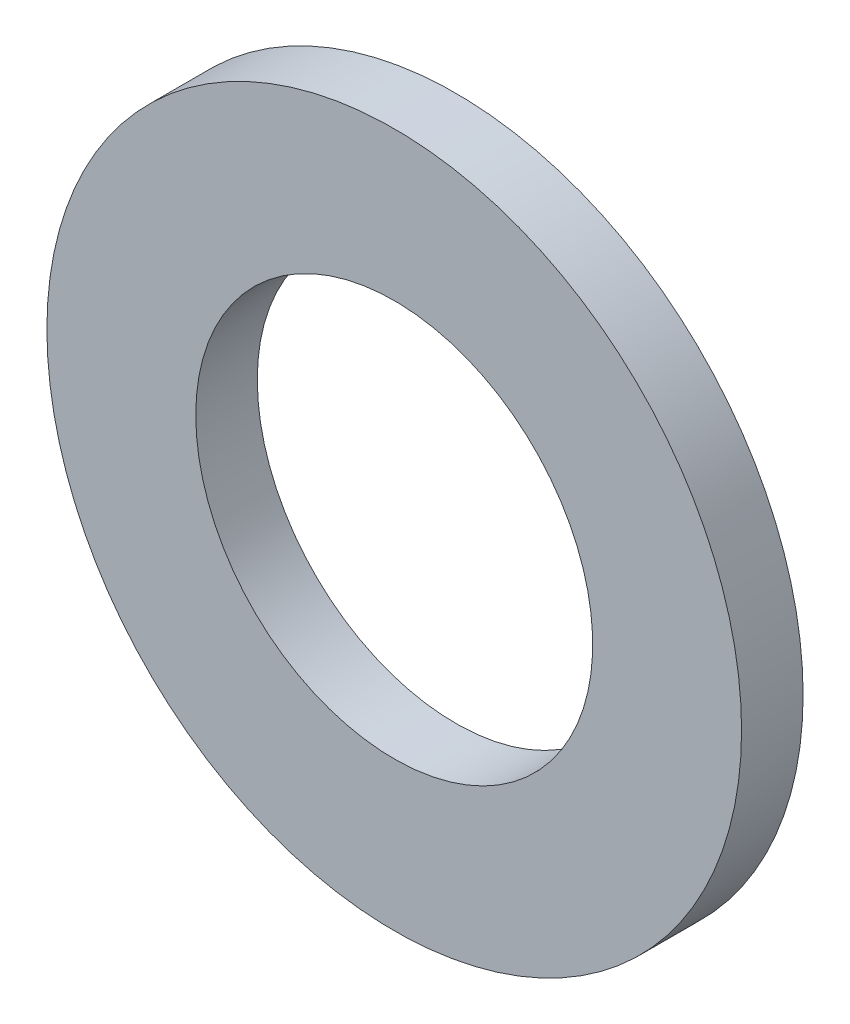
ISO-10303-21;
HEADER;
FILE_DESCRIPTION(('STEP AP214'),'2;1');
FILE_NAME('part.step','',(''),(''),'','','');
FILE_SCHEMA(('AUTOMOTIVE_DESIGN { 1 0 10303 214 1 1 1 1 }'));
ENDSEC;
DATA;
#1=APPLICATION_CONTEXT('core data for automotive mechanical design processes');
#2=APPLICATION_PROTOCOL_DEFINITION('international standard','automotive_design',2000,#1);
#3=PRODUCT_CONTEXT('',#1,'mechanical');
#4=PRODUCT('Part','Part','',(#3));
#5=PRODUCT_RELATED_PRODUCT_CATEGORY('part','',(#4));
#6=PRODUCT_DEFINITION_FORMATION('','',#4);
#7=PRODUCT_DEFINITION_CONTEXT('part definition',#1,'design');
#8=PRODUCT_DEFINITION('design','',#6,#7);
#9=PRODUCT_DEFINITION_SHAPE('','',#8);
#10=(LENGTH_UNIT() NAMED_UNIT(*) SI_UNIT(.MILLI.,.METRE.));
#11=(NAMED_UNIT(*) PLANE_ANGLE_UNIT() SI_UNIT($,.RADIAN.));
#12=(NAMED_UNIT(*) SI_UNIT($,.STERADIAN.) SOLID_ANGLE_UNIT());
#13=UNCERTAINTY_MEASURE_WITH_UNIT(LENGTH_MEASURE(1.E-05),#10,'distance_accuracy_value','');
#14=(GEOMETRIC_REPRESENTATION_CONTEXT(3) GLOBAL_UNCERTAINTY_ASSIGNED_CONTEXT((#13)) GLOBAL_UNIT_ASSIGNED_CONTEXT((#10,
#11,#12)) REPRESENTATION_CONTEXT('',''));
#15=CARTESIAN_POINT('',(0.,0.,0.));
#16=DIRECTION('',(0.,0.,1.));
#17=DIRECTION('',(1.,0.,0.));
#18=AXIS2_PLACEMENT_3D('',#15,#16,#17);
#19=CARTESIAN_POINT('',(0.,0.,3.1));
#20=DIRECTION('',(0.,0.,1.));
#21=DIRECTION('',(1.,0.,0.));
#22=AXIS2_PLACEMENT_3D('',#19,#20,#21);
#23=PLANE('',#22);
#24=CARTESIAN_POINT('',(0.,0.,3.1));
#25=DIRECTION('',(0.,0.,1.));
#26=DIRECTION('',(1.,0.,0.));
#27=AXIS2_PLACEMENT_3D('',#24,#25,#26);
#28=CIRCLE('',#27,17.5);
#29=CARTESIAN_POINT('',(-17.5,0.,3.1));
#30=VERTEX_POINT('',#29);
#31=EDGE_CURVE('E10',#30,#30,#28,.T.);
#32=ORIENTED_EDGE('',*,*,#31,.T.);
#33=EDGE_LOOP('',(#32));
#34=FACE_BOUND('',#33,.T.);
#35=CARTESIAN_POINT('',(0.,0.,3.1));
#36=DIRECTION('',(0.,0.,1.));
#37=DIRECTION('',(1.,0.,0.));
#38=AXIS2_PLACEMENT_3D('',#35,#36,#37);
#39=CIRCLE('',#38,10.);
#40=CARTESIAN_POINT('',(-10.,0.,3.1));
#41=VERTEX_POINT('',#40);
#42=EDGE_CURVE('E50',#41,#41,#39,.T.);
#43=ORIENTED_EDGE('',*,*,#42,.F.);
#44=EDGE_LOOP('',(#43));
#45=FACE_BOUND('',#44,.T.);
#46=ADVANCED_FACE('F39',(#34,#45),#23,.T.);
#47=CARTESIAN_POINT('',(0.,0.,0.));
#48=DIRECTION('',(0.,0.,1.));
#49=DIRECTION('',(1.,0.,0.));
#50=AXIS2_PLACEMENT_3D('',#47,#48,#49);
#51=PLANE('',#50);
#52=CARTESIAN_POINT('',(0.,0.,0.));
#53=DIRECTION('',(0.,0.,1.));
#54=DIRECTION('',(1.,0.,0.));
#55=AXIS2_PLACEMENT_3D('',#52,#53,#54);
#56=CIRCLE('',#55,17.5);
#57=CARTESIAN_POINT('',(-17.5,0.,0.));
#58=VERTEX_POINT('',#57);
#59=EDGE_CURVE('E43',#58,#58,#56,.T.);
#60=ORIENTED_EDGE('',*,*,#59,.F.);
#61=EDGE_LOOP('',(#60));
#62=FACE_BOUND('',#61,.T.);
#63=CARTESIAN_POINT('',(0.,0.,0.));
#64=DIRECTION('',(0.,0.,1.));
#65=DIRECTION('',(1.,0.,0.));
#66=AXIS2_PLACEMENT_3D('',#63,#64,#65);
#67=CIRCLE('',#66,10.);
#68=CARTESIAN_POINT('',(-10.,0.,0.));
#69=VERTEX_POINT('',#68);
#70=EDGE_CURVE('E52',#69,#69,#67,.T.);
#71=ORIENTED_EDGE('',*,*,#70,.T.);
#72=EDGE_LOOP('',(#71));
#73=FACE_BOUND('',#72,.T.);
#74=ADVANCED_FACE('F62',(#62,#73),#51,.F.);
#75=CARTESIAN_POINT('',(0.,0.,3.1));
#76=DIRECTION('',(0.,0.,-1.));
#77=DIRECTION('',(-1.,0.,0.));
#78=AXIS2_PLACEMENT_3D('',#75,#76,#77);
#79=CYLINDRICAL_SURFACE('',#78,17.5);
#80=CARTESIAN_POINT('',(-17.5,0.,3.1));
#81=CARTESIAN_POINT('',(-17.5,0.,3.06770833333333));
#82=CARTESIAN_POINT('',(-17.5,0.,3.03541666666667));
#83=CARTESIAN_POINT('',(-17.5,0.,2.97083333333333));
#84=CARTESIAN_POINT('',(-17.5,0.,2.93854166666667));
#85=CARTESIAN_POINT('',(-17.5,0.,2.87395833333333));
#86=CARTESIAN_POINT('',(-17.5,0.,2.84166666666667));
#87=CARTESIAN_POINT('',(-17.5,0.,2.77708333333333));
#88=CARTESIAN_POINT('',(-17.5,0.,2.74479166666667));
#89=CARTESIAN_POINT('',(-17.5,0.,2.68020833333333));
#90=CARTESIAN_POINT('',(-17.5,0.,2.64791666666667));
#91=CARTESIAN_POINT('',(-17.5,0.,2.58333333333333));
#92=CARTESIAN_POINT('',(-17.5,0.,2.55104166666667));
#93=CARTESIAN_POINT('',(-17.5,0.,2.48645833333333));
#94=CARTESIAN_POINT('',(-17.5,0.,2.45416666666667));
#95=CARTESIAN_POINT('',(-17.5,0.,2.38958333333333));
#96=CARTESIAN_POINT('',(-17.5,0.,2.35729166666667));
#97=CARTESIAN_POINT('',(-17.5,0.,2.29270833333333));
#98=CARTESIAN_POINT('',(-17.5,0.,2.26041666666667));
#99=CARTESIAN_POINT('',(-17.5,0.,2.19583333333333));
#100=CARTESIAN_POINT('',(-17.5,0.,2.16354166666667));
#101=CARTESIAN_POINT('',(-17.5,0.,2.09895833333333));
#102=CARTESIAN_POINT('',(-17.5,0.,2.06666666666667));
#103=CARTESIAN_POINT('',(-17.5,0.,2.00208333333333));
#104=CARTESIAN_POINT('',(-17.5,0.,1.96979166666667));
#105=CARTESIAN_POINT('',(-17.5,0.,1.90520833333333));
#106=CARTESIAN_POINT('',(-17.5,0.,1.87291666666667));
#107=CARTESIAN_POINT('',(-17.5,0.,1.80833333333333));
#108=CARTESIAN_POINT('',(-17.5,0.,1.77604166666667));
#109=CARTESIAN_POINT('',(-17.5,0.,1.71145833333333));
#110=CARTESIAN_POINT('',(-17.5,0.,1.67916666666667));
#111=CARTESIAN_POINT('',(-17.5,0.,1.61458333333333));
#112=CARTESIAN_POINT('',(-17.5,0.,1.58229166666667));
#113=CARTESIAN_POINT('',(-17.5,0.,1.51770833333333));
#114=CARTESIAN_POINT('',(-17.5,0.,1.48541666666667));
#115=CARTESIAN_POINT('',(-17.5,0.,1.42083333333333));
#116=CARTESIAN_POINT('',(-17.5,0.,1.38854166666667));
#117=CARTESIAN_POINT('',(-17.5,0.,1.32395833333333));
#118=CARTESIAN_POINT('',(-17.5,0.,1.29166666666667));
#119=CARTESIAN_POINT('',(-17.5,0.,1.22708333333333));
#120=CARTESIAN_POINT('',(-17.5,0.,1.19479166666667));
#121=CARTESIAN_POINT('',(-17.5,0.,1.13020833333333));
#122=CARTESIAN_POINT('',(-17.5,0.,1.09791666666667));
#123=CARTESIAN_POINT('',(-17.5,0.,1.03333333333333));
#124=CARTESIAN_POINT('',(-17.5,0.,1.00104166666667));
#125=CARTESIAN_POINT('',(-17.5,0.,0.936458333333333));
#126=CARTESIAN_POINT('',(-17.5,0.,0.904166666666667));
#127=CARTESIAN_POINT('',(-17.5,0.,0.839583333333334));
#128=CARTESIAN_POINT('',(-17.5,0.,0.807291666666667));
#129=CARTESIAN_POINT('',(-17.5,0.,0.742708333333333));
#130=CARTESIAN_POINT('',(-17.5,0.,0.710416666666667));
#131=CARTESIAN_POINT('',(-17.5,0.,0.645833333333333));
#132=CARTESIAN_POINT('',(-17.5,0.,0.613541666666667));
#133=CARTESIAN_POINT('',(-17.5,0.,0.548958333333333));
#134=CARTESIAN_POINT('',(-17.5,0.,0.516666666666667));
#135=CARTESIAN_POINT('',(-17.5,0.,0.452083333333333));
#136=CARTESIAN_POINT('',(-17.5,0.,0.419791666666667));
#137=CARTESIAN_POINT('',(-17.5,0.,0.355208333333333));
#138=CARTESIAN_POINT('',(-17.5,0.,0.322916666666667));
#139=CARTESIAN_POINT('',(-17.5,0.,0.258333333333333));
#140=CARTESIAN_POINT('',(-17.5,0.,0.226041666666667));
#141=CARTESIAN_POINT('',(-17.5,0.,0.161458333333333));
#142=CARTESIAN_POINT('',(-17.5,0.,0.129166666666667));
#143=CARTESIAN_POINT('',(-17.5,0.,0.0645833333333335));
#144=CARTESIAN_POINT('',(-17.5,0.,0.0322916666666667));
#145=CARTESIAN_POINT('',(-17.5,0.,0.));
#146=B_SPLINE_CURVE_WITH_KNOTS('',3,(#80,#81,#82,#83,#84,#85,#86,#87,#88,#89,#90,#91,#92,#93,
#94,#95,#96,#97,#98,#99,#100,#101,#102,#103,#104,#105,#106,#107,#108,#109,#110,#111,#112,#113,
#114,#115,#116,#117,#118,#119,#120,#121,#122,#123,#124,#125,#126,#127,#128,#129,#130,#131,#132,
#133,#134,#135,#136,#137,#138,#139,#140,#141,#142,#143,#144,#145),.UNSPECIFIED.,.F.,.F.,(4,2,2,
2,2,2,2,2,2,2,2,2,2,2,2,2,2,2,2,2,2,2,2,2,2,2,2,2,2,2,2,2,4),(0.,0.0968750000000002,0.19375,
0.290625,0.3875,0.484375,0.58125,0.678125,0.775,0.871875,0.96875,1.065625,1.1625,1.259375,
1.35625,1.453125,1.55,1.646875,1.74375,1.840625,1.9375,2.034375,2.13125,2.228125,2.325,2.421875,
2.51875,2.615625,2.7125,2.809375,2.90625,3.003125,3.1),.UNSPECIFIED.);
#147=EDGE_CURVE('BSEAM41',#30,#58,#146,.T.);
#148=ORIENTED_EDGE('',*,*,#31,.F.);
#149=ORIENTED_EDGE('',*,*,#59,.T.);
#150=ORIENTED_EDGE('',*,*,#147,.T.);
#151=ORIENTED_EDGE('',*,*,#147,.F.);
#152=EDGE_LOOP('',(#148,#150,#149,#151));
#153=FACE_BOUND('',#152,.T.);
#154=ADVANCED_FACE('F41',(#153),#79,.T.);
#155=CARTESIAN_POINT('',(0.,0.,3.1));
#156=DIRECTION('',(0.,0.,-1.));
#157=DIRECTION('',(-1.,0.,0.));
#158=AXIS2_PLACEMENT_3D('',#155,#156,#157);
#159=CYLINDRICAL_SURFACE('',#158,10.);
#160=CARTESIAN_POINT('',(-10.,0.,3.1));
#161=CARTESIAN_POINT('',(-10.,0.,3.06770833333333));
#162=CARTESIAN_POINT('',(-10.,0.,3.03541666666667));
#163=CARTESIAN_POINT('',(-10.,0.,2.97083333333333));
#164=CARTESIAN_POINT('',(-10.,0.,2.93854166666667));
#165=CARTESIAN_POINT('',(-10.,0.,2.87395833333333));
#166=CARTESIAN_POINT('',(-10.,0.,2.84166666666667));
#167=CARTESIAN_POINT('',(-10.,0.,2.77708333333333));
#168=CARTESIAN_POINT('',(-10.,0.,2.74479166666667));
#169=CARTESIAN_POINT('',(-10.,0.,2.68020833333333));
#170=CARTESIAN_POINT('',(-10.,0.,2.64791666666667));
#171=CARTESIAN_POINT('',(-10.,0.,2.58333333333333));
#172=CARTESIAN_POINT('',(-10.,0.,2.55104166666667));
#173=CARTESIAN_POINT('',(-10.,0.,2.48645833333333));
#174=CARTESIAN_POINT('',(-10.,0.,2.45416666666667));
#175=CARTESIAN_POINT('',(-10.,0.,2.38958333333333));
#176=CARTESIAN_POINT('',(-10.,0.,2.35729166666667));
#177=CARTESIAN_POINT('',(-10.,0.,2.29270833333333));
#178=CARTESIAN_POINT('',(-10.,0.,2.26041666666667));
#179=CARTESIAN_POINT('',(-10.,0.,2.19583333333333));
#180=CARTESIAN_POINT('',(-10.,0.,2.16354166666667));
#181=CARTESIAN_POINT('',(-10.,0.,2.09895833333333));
#182=CARTESIAN_POINT('',(-10.,0.,2.06666666666667));
#183=CARTESIAN_POINT('',(-10.,0.,2.00208333333333));
#184=CARTESIAN_POINT('',(-10.,0.,1.96979166666667));
#185=CARTESIAN_POINT('',(-10.,0.,1.90520833333333));
#186=CARTESIAN_POINT('',(-10.,0.,1.87291666666667));
#187=CARTESIAN_POINT('',(-10.,0.,1.80833333333333));
#188=CARTESIAN_POINT('',(-10.,0.,1.77604166666667));
#189=CARTESIAN_POINT('',(-10.,0.,1.71145833333333));
#190=CARTESIAN_POINT('',(-10.,0.,1.67916666666667));
#191=CARTESIAN_POINT('',(-10.,0.,1.61458333333333));
#192=CARTESIAN_POINT('',(-10.,0.,1.58229166666667));
#193=CARTESIAN_POINT('',(-10.,0.,1.51770833333333));
#194=CARTESIAN_POINT('',(-10.,0.,1.48541666666667));
#195=CARTESIAN_POINT('',(-10.,0.,1.42083333333333));
#196=CARTESIAN_POINT('',(-10.,0.,1.38854166666667));
#197=CARTESIAN_POINT('',(-10.,0.,1.32395833333333));
#198=CARTESIAN_POINT('',(-10.,0.,1.29166666666667));
#199=CARTESIAN_POINT('',(-10.,0.,1.22708333333333));
#200=CARTESIAN_POINT('',(-10.,0.,1.19479166666667));
#201=CARTESIAN_POINT('',(-10.,0.,1.13020833333333));
#202=CARTESIAN_POINT('',(-10.,0.,1.09791666666667));
#203=CARTESIAN_POINT('',(-10.,0.,1.03333333333333));
#204=CARTESIAN_POINT('',(-10.,0.,1.00104166666667));
#205=CARTESIAN_POINT('',(-10.,0.,0.936458333333333));
#206=CARTESIAN_POINT('',(-10.,0.,0.904166666666667));
#207=CARTESIAN_POINT('',(-10.,0.,0.839583333333334));
#208=CARTESIAN_POINT('',(-10.,0.,0.807291666666667));
#209=CARTESIAN_POINT('',(-10.,0.,0.742708333333333));
#210=CARTESIAN_POINT('',(-10.,0.,0.710416666666667));
#211=CARTESIAN_POINT('',(-10.,0.,0.645833333333333));
#212=CARTESIAN_POINT('',(-10.,0.,0.613541666666667));
#213=CARTESIAN_POINT('',(-10.,0.,0.548958333333333));
#214=CARTESIAN_POINT('',(-10.,0.,0.516666666666667));
#215=CARTESIAN_POINT('',(-10.,0.,0.452083333333333));
#216=CARTESIAN_POINT('',(-10.,0.,0.419791666666667));
#217=CARTESIAN_POINT('',(-10.,0.,0.355208333333333));
#218=CARTESIAN_POINT('',(-10.,0.,0.322916666666667));
#219=CARTESIAN_POINT('',(-10.,0.,0.258333333333333));
#220=CARTESIAN_POINT('',(-10.,0.,0.226041666666667));
#221=CARTESIAN_POINT('',(-10.,0.,0.161458333333333));
#222=CARTESIAN_POINT('',(-10.,0.,0.129166666666667));
#223=CARTESIAN_POINT('',(-10.,0.,0.0645833333333335));
#224=CARTESIAN_POINT('',(-10.,0.,0.0322916666666667));
#225=CARTESIAN_POINT('',(-10.,0.,0.));
#226=B_SPLINE_CURVE_WITH_KNOTS('',3,(#160,#161,#162,#163,#164,#165,#166,#167,#168,#169,#170,
#171,#172,#173,#174,#175,#176,#177,#178,#179,#180,#181,#182,#183,#184,#185,#186,#187,#188,#189,
#190,#191,#192,#193,#194,#195,#196,#197,#198,#199,#200,#201,#202,#203,#204,#205,#206,#207,#208,
#209,#210,#211,#212,#213,#214,#215,#216,#217,#218,#219,#220,#221,#222,#223,#224,#225),
.UNSPECIFIED.,.F.,.F.,(4,2,2,2,2,2,2,2,2,2,2,2,2,2,2,2,2,2,2,2,2,2,2,2,2,2,2,2,2,2,2,2,4),(0.,
0.0968750000000002,0.19375,0.290625,0.3875,0.484375,0.58125,0.678125,0.775,0.871875,0.96875,
1.065625,1.1625,1.259375,1.35625,1.453125,1.55,1.646875,1.74375,1.840625,1.9375,2.034375,
2.13125,2.228125,2.325,2.421875,2.51875,2.615625,2.7125,2.809375,2.90625,3.003125,3.1),.UNSPECIFIED.);
#227=EDGE_CURVE('BSEAM58',#41,#69,#226,.T.);
#228=ORIENTED_EDGE('',*,*,#42,.T.);
#229=ORIENTED_EDGE('',*,*,#70,.F.);
#230=ORIENTED_EDGE('',*,*,#227,.T.);
#231=ORIENTED_EDGE('',*,*,#227,.F.);
#232=EDGE_LOOP('',(#228,#230,#229,#231));
#233=FACE_BOUND('',#232,.T.);
#234=ADVANCED_FACE('F58',(#233),#159,.F.);
#235=CLOSED_SHELL('',(#46,#74,#154,#234));
#236=MANIFOLD_SOLID_BREP('B2',#235);
#237=ADVANCED_BREP_SHAPE_REPRESENTATION('',(#18,#236),#14);
#238=SHAPE_DEFINITION_REPRESENTATION(#9,#237);
ENDSEC;
END-ISO-10303-21;
